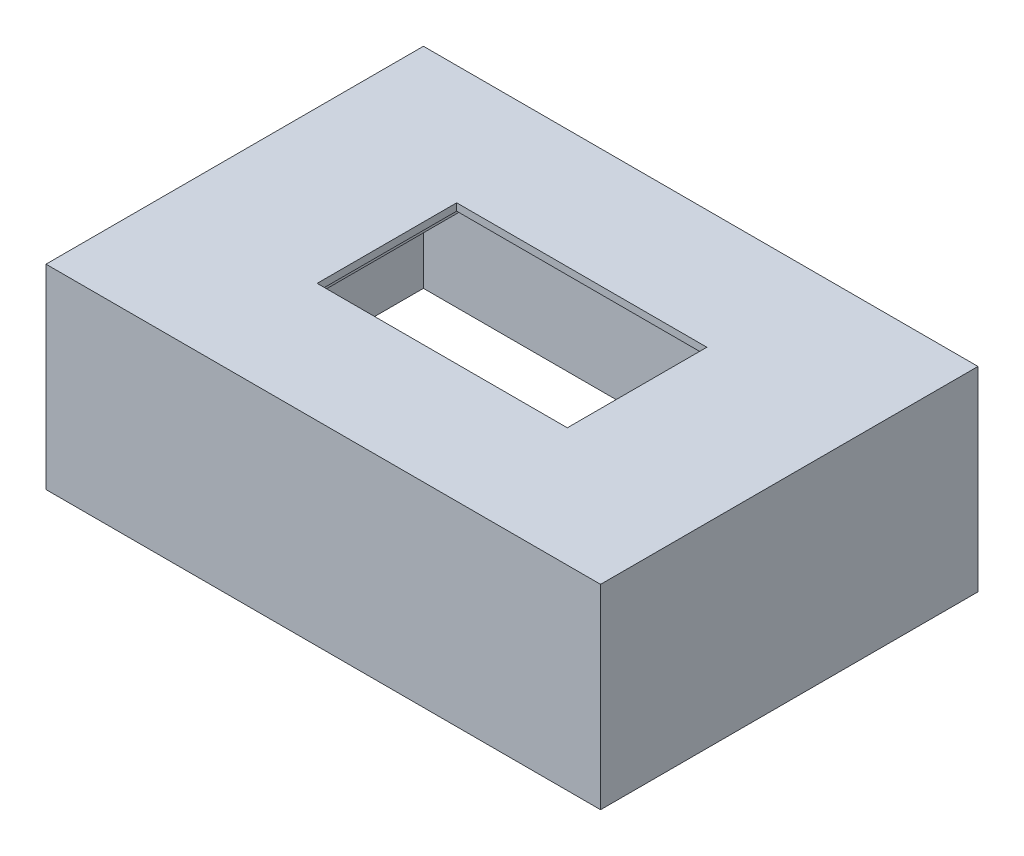
ISO-10303-21;
HEADER;
FILE_DESCRIPTION(('STEP AP214'),'2;1');
FILE_NAME('part.step','',(''),(''),'','','');
FILE_SCHEMA(('AUTOMOTIVE_DESIGN { 1 0 10303 214 1 1 1 1 }'));
ENDSEC;
DATA;
#1=APPLICATION_CONTEXT('core data for automotive mechanical design processes');
#2=APPLICATION_PROTOCOL_DEFINITION('international standard','automotive_design',2000,#1);
#3=PRODUCT_CONTEXT('',#1,'mechanical');
#4=PRODUCT('Part','Part','',(#3));
#5=PRODUCT_RELATED_PRODUCT_CATEGORY('part','',(#4));
#6=PRODUCT_DEFINITION_FORMATION('','',#4);
#7=PRODUCT_DEFINITION_CONTEXT('part definition',#1,'design');
#8=PRODUCT_DEFINITION('design','',#6,#7);
#9=PRODUCT_DEFINITION_SHAPE('','',#8);
#10=(LENGTH_UNIT() NAMED_UNIT(*) SI_UNIT(.MILLI.,.METRE.));
#11=(NAMED_UNIT(*) PLANE_ANGLE_UNIT() SI_UNIT($,.RADIAN.));
#12=(NAMED_UNIT(*) SI_UNIT($,.STERADIAN.) SOLID_ANGLE_UNIT());
#13=UNCERTAINTY_MEASURE_WITH_UNIT(LENGTH_MEASURE(1.E-05),#10,'distance_accuracy_value','');
#14=(GEOMETRIC_REPRESENTATION_CONTEXT(3) GLOBAL_UNCERTAINTY_ASSIGNED_CONTEXT((#13)) GLOBAL_UNIT_ASSIGNED_CONTEXT((#10,
#11,#12)) REPRESENTATION_CONTEXT('',''));
#15=CARTESIAN_POINT('',(0.,0.,0.));
#16=DIRECTION('',(0.,0.,1.));
#17=DIRECTION('',(1.,0.,0.));
#18=AXIS2_PLACEMENT_3D('',#15,#16,#17);
#19=CARTESIAN_POINT('',(-35.8900807899462,-14.6188086645724,22.0750448833034));
#20=DIRECTION('',(-1.,0.,0.));
#21=DIRECTION('',(0.,0.,1.));
#22=AXIS2_PLACEMENT_3D('',#19,#20,#21);
#23=PLANE('',#22);
#24=DIRECTION('',(0.,0.,1.));
#25=VECTOR('',#24,1.);
#26=CARTESIAN_POINT('',(-35.8900807899462,26.,22.0750448833034));
#27=LINE('',#26,#25);
#28=CARTESIAN_POINT('',(-35.8900807899462,26.,22.0750448833034));
#29=VERTEX_POINT('',#28);
#30=CARTESIAN_POINT('',(-35.8900807899462,26.,41.3750448833034));
#31=VERTEX_POINT('',#30);
#32=EDGE_CURVE('E357',#29,#31,#27,.T.);
#33=ORIENTED_EDGE('',*,*,#32,.F.);
#34=DIRECTION('',(0.,1.,0.));
#35=VECTOR('',#34,1.);
#36=CARTESIAN_POINT('',(-35.8900807899462,-14.6188086645724,22.0750448833034));
#37=LINE('',#36,#35);
#38=CARTESIAN_POINT('',(-35.8900807899462,27.,22.0750448833034));
#39=VERTEX_POINT('',#38);
#40=EDGE_CURVE('E377',#29,#39,#37,.T.);
#41=ORIENTED_EDGE('',*,*,#40,.T.);
#42=DIRECTION('',(0.,0.,1.));
#43=VECTOR('',#42,1.);
#44=CARTESIAN_POINT('',(-35.8900807899462,27.,22.0750448833034));
#45=LINE('',#44,#43);
#46=CARTESIAN_POINT('',(-35.8900807899462,27.,41.3750448833034));
#47=VERTEX_POINT('',#46);
#48=EDGE_CURVE('E360',#39,#47,#45,.T.);
#49=ORIENTED_EDGE('',*,*,#48,.T.);
#50=DIRECTION('',(0.,1.,0.));
#51=VECTOR('',#50,1.);
#52=CARTESIAN_POINT('',(-35.8900807899462,-14.6188086645724,41.3750448833034));
#53=LINE('',#52,#51);
#54=EDGE_CURVE('E376',#31,#47,#53,.T.);
#55=ORIENTED_EDGE('',*,*,#54,.F.);
#56=EDGE_LOOP('',(#33,#41,#49,#55));
#57=FACE_BOUND('',#56,.T.);
#58=ADVANCED_FACE('F38',(#57),#23,.F.);
#59=CARTESIAN_POINT('',(-35.8900807899462,-14.6188086645724,22.0750448833034));
#60=DIRECTION('',(0.,0.,-1.));
#61=DIRECTION('',(-1.,0.,0.));
#62=AXIS2_PLACEMENT_3D('',#59,#60,#61);
#63=PLANE('',#62);
#64=DIRECTION('',(-1.,0.,0.));
#65=VECTOR('',#64,1.);
#66=CARTESIAN_POINT('',(-35.8900807899462,26.,22.0750448833034));
#67=LINE('',#66,#65);
#68=CARTESIAN_POINT('',(-1.29008078994616,26.,22.0750448833034));
#69=VERTEX_POINT('',#68);
#70=EDGE_CURVE('E354',#69,#29,#67,.T.);
#71=ORIENTED_EDGE('',*,*,#70,.F.);
#72=DIRECTION('',(0.,1.,0.));
#73=VECTOR('',#72,1.);
#74=CARTESIAN_POINT('',(-1.29008078994616,-14.6188086645724,22.0750448833034));
#75=LINE('',#74,#73);
#76=CARTESIAN_POINT('',(-1.29008078994616,27.,22.0750448833034));
#77=VERTEX_POINT('',#76);
#78=EDGE_CURVE('E381',#69,#77,#75,.T.);
#79=ORIENTED_EDGE('',*,*,#78,.T.);
#80=DIRECTION('',(-1.,0.,0.));
#81=VECTOR('',#80,1.);
#82=CARTESIAN_POINT('',(-35.8900807899462,27.,22.0750448833034));
#83=LINE('',#82,#81);
#84=EDGE_CURVE('E372',#77,#39,#83,.T.);
#85=ORIENTED_EDGE('',*,*,#84,.T.);
#86=ORIENTED_EDGE('',*,*,#40,.F.);
#87=EDGE_LOOP('',(#71,#79,#85,#86));
#88=FACE_BOUND('',#87,.T.);
#89=ADVANCED_FACE('F487',(#88),#63,.F.);
#90=CARTESIAN_POINT('',(-1.29008078994616,-14.6188086645724,22.0750448833034));
#91=DIRECTION('',(1.,0.,0.));
#92=DIRECTION('',(0.,0.,-1.));
#93=AXIS2_PLACEMENT_3D('',#90,#91,#92);
#94=PLANE('',#93);
#95=DIRECTION('',(0.,0.,-1.));
#96=VECTOR('',#95,1.);
#97=CARTESIAN_POINT('',(-1.29008078994616,26.,22.0750448833034));
#98=LINE('',#97,#96);
#99=CARTESIAN_POINT('',(-1.29008078994616,26.,41.3750448833034));
#100=VERTEX_POINT('',#99);
#101=EDGE_CURVE('E342',#100,#69,#98,.T.);
#102=ORIENTED_EDGE('',*,*,#101,.F.);
#103=DIRECTION('',(0.,1.,0.));
#104=VECTOR('',#103,1.);
#105=CARTESIAN_POINT('',(-1.29008078994616,-14.6188086645724,41.3750448833034));
#106=LINE('',#105,#104);
#107=CARTESIAN_POINT('',(-1.29008078994616,27.,41.3750448833034));
#108=VERTEX_POINT('',#107);
#109=EDGE_CURVE('E384',#100,#108,#106,.T.);
#110=ORIENTED_EDGE('',*,*,#109,.T.);
#111=DIRECTION('',(0.,0.,-1.));
#112=VECTOR('',#111,1.);
#113=CARTESIAN_POINT('',(-1.29008078994616,27.,22.0750448833034));
#114=LINE('',#113,#112);
#115=EDGE_CURVE('E368',#108,#77,#114,.T.);
#116=ORIENTED_EDGE('',*,*,#115,.T.);
#117=ORIENTED_EDGE('',*,*,#78,.F.);
#118=EDGE_LOOP('',(#102,#110,#116,#117));
#119=FACE_BOUND('',#118,.T.);
#120=ADVANCED_FACE('F481',(#119),#94,.F.);
#121=CARTESIAN_POINT('',(-35.8900807899462,-14.6188086645724,41.3750448833034));
#122=DIRECTION('',(0.,0.,1.));
#123=DIRECTION('',(1.,0.,0.));
#124=AXIS2_PLACEMENT_3D('',#121,#122,#123);
#125=PLANE('',#124);
#126=DIRECTION('',(1.,0.,0.));
#127=VECTOR('',#126,1.);
#128=CARTESIAN_POINT('',(-35.8900807899462,26.,41.3750448833034));
#129=LINE('',#128,#127);
#130=EDGE_CURVE('E274',#31,#100,#129,.T.);
#131=ORIENTED_EDGE('',*,*,#130,.F.);
#132=ORIENTED_EDGE('',*,*,#54,.T.);
#133=DIRECTION('',(1.,0.,0.));
#134=VECTOR('',#133,1.);
#135=CARTESIAN_POINT('',(-35.8900807899462,27.,41.3750448833034));
#136=LINE('',#135,#134);
#137=EDGE_CURVE('E364',#47,#108,#136,.T.);
#138=ORIENTED_EDGE('',*,*,#137,.T.);
#139=ORIENTED_EDGE('',*,*,#109,.F.);
#140=EDGE_LOOP('',(#131,#132,#138,#139));
#141=FACE_BOUND('',#140,.T.);
#142=ADVANCED_FACE('F472',(#141),#125,.F.);
#143=CARTESIAN_POINT('',(0.,25.,0.));
#144=DIRECTION('',(0.,1.,0.));
#145=DIRECTION('',(0.,0.,1.));
#146=AXIS2_PLACEMENT_3D('',#143,#144,#145);
#147=PLANE('',#146);
#148=DIRECTION('',(0.,0.,-1.));
#149=VECTOR('',#148,1.);
#150=CARTESIAN_POINT('',(-52.9400807899462,25.,0.));
#151=LINE('',#150,#149);
#152=CARTESIAN_POINT('',(-52.9400807899462,25.,53.8250448833034));
#153=VERTEX_POINT('',#152);
#154=CARTESIAN_POINT('',(-52.9400807899462,25.,9.6250448833034));
#155=VERTEX_POINT('',#154);
#156=EDGE_CURVE('E284',#153,#155,#151,.T.);
#157=ORIENTED_EDGE('',*,*,#156,.T.);
#158=DIRECTION('',(1.,0.,0.));
#159=VECTOR('',#158,1.);
#160=CARTESIAN_POINT('',(0.,25.,9.6250448833034));
#161=LINE('',#160,#159);
#162=CARTESIAN_POINT('',(15.7599192100539,25.,9.6250448833034));
#163=VERTEX_POINT('',#162);
#164=EDGE_CURVE('E290',#155,#163,#161,.T.);
#165=ORIENTED_EDGE('',*,*,#164,.T.);
#166=DIRECTION('',(0.,0.,1.));
#167=VECTOR('',#166,1.);
#168=CARTESIAN_POINT('',(15.7599192100539,25.,0.));
#169=LINE('',#168,#167);
#170=CARTESIAN_POINT('',(15.7599192100539,25.,53.8250448833034));
#171=VERTEX_POINT('',#170);
#172=EDGE_CURVE('E287',#163,#171,#169,.T.);
#173=ORIENTED_EDGE('',*,*,#172,.T.);
#174=DIRECTION('',(-1.,0.,0.));
#175=VECTOR('',#174,1.);
#176=CARTESIAN_POINT('',(0.,25.,53.8250448833034));
#177=LINE('',#176,#175);
#178=EDGE_CURVE('E281',#171,#153,#177,.T.);
#179=ORIENTED_EDGE('',*,*,#178,.T.);
#180=EDGE_LOOP('',(#157,#165,#173,#179));
#181=FACE_BOUND('',#180,.T.);
#182=DIRECTION('',(1.,0.,0.));
#183=VECTOR('',#182,1.);
#184=CARTESIAN_POINT('',(-36.5900807899461,25.,14.5750448833034));
#185=LINE('',#184,#183);
#186=CARTESIAN_POINT('',(-36.5900807899461,25.,14.5750448833034));
#187=VERTEX_POINT('',#186);
#188=CARTESIAN_POINT('',(-0.590080789946152,25.,14.5750448833034));
#189=VERTEX_POINT('',#188);
#190=EDGE_CURVE('E318',#187,#189,#185,.T.);
#191=ORIENTED_EDGE('',*,*,#190,.F.);
#192=DIRECTION('',(0.,0.,-1.));
#193=VECTOR('',#192,1.);
#194=CARTESIAN_POINT('',(-36.5900807899461,25.,48.8750448833034));
#195=LINE('',#194,#193);
#196=CARTESIAN_POINT('',(-36.5900807899461,25.,48.8750448833034));
#197=VERTEX_POINT('',#196);
#198=EDGE_CURVE('E312',#197,#187,#195,.T.);
#199=ORIENTED_EDGE('',*,*,#198,.F.);
#200=DIRECTION('',(-1.,0.,0.));
#201=VECTOR('',#200,1.);
#202=CARTESIAN_POINT('',(-36.5900807899461,25.,48.8750448833034));
#203=LINE('',#202,#201);
#204=CARTESIAN_POINT('',(-0.590080789946155,25.,48.8750448833034));
#205=VERTEX_POINT('',#204);
#206=EDGE_CURVE('E334',#205,#197,#203,.T.);
#207=ORIENTED_EDGE('',*,*,#206,.F.);
#208=DIRECTION('',(0.,0.,1.));
#209=VECTOR('',#208,1.);
#210=CARTESIAN_POINT('',(-0.590080789946155,25.,48.8750448833034));
#211=LINE('',#210,#209);
#212=EDGE_CURVE('E325',#189,#205,#211,.T.);
#213=ORIENTED_EDGE('',*,*,#212,.F.);
#214=EDGE_LOOP('',(#191,#199,#207,#213));
#215=FACE_BOUND('',#214,.T.);
#216=ADVANCED_FACE('F470',(#181,#215),#147,.F.);
#217=CARTESIAN_POINT('',(0.,0.,0.));
#218=DIRECTION('',(0.,1.,0.));
#219=DIRECTION('',(0.,0.,1.));
#220=AXIS2_PLACEMENT_3D('',#217,#218,#219);
#221=PLANE('',#220);
#222=DIRECTION('',(0.,0.,1.));
#223=VECTOR('',#222,1.);
#224=CARTESIAN_POINT('',(-54.9400807899462,0.,7.62504488330341));
#225=LINE('',#224,#223);
#226=CARTESIAN_POINT('',(-54.9400807899462,0.,7.62504488330341));
#227=VERTEX_POINT('',#226);
#228=CARTESIAN_POINT('',(-54.9400807899462,0.,27.1283231315116));
#229=VERTEX_POINT('',#228);
#230=EDGE_CURVE('E205',#227,#229,#225,.T.);
#231=ORIENTED_EDGE('',*,*,#230,.T.);
#232=DIRECTION('',(-1.,0.,0.));
#233=VECTOR('',#232,1.);
#234=CARTESIAN_POINT('',(-37.0025301753447,0.,27.1283231315116));
#235=LINE('',#234,#233);
#236=CARTESIAN_POINT('',(-56.9400807899462,0.,27.1283231315116));
#237=VERTEX_POINT('',#236);
#238=EDGE_CURVE('E189',#229,#237,#235,.T.);
#239=ORIENTED_EDGE('',*,*,#238,.T.);
#240=DIRECTION('',(0.,0.,1.));
#241=VECTOR('',#240,1.);
#242=CARTESIAN_POINT('',(-56.9400807899462,0.,5.62504488330341));
#243=LINE('',#242,#241);
#244=CARTESIAN_POINT('',(-56.9400807899462,0.,5.62504488330341));
#245=VERTEX_POINT('',#244);
#246=EDGE_CURVE('E246',#245,#237,#243,.T.);
#247=ORIENTED_EDGE('',*,*,#246,.F.);
#248=DIRECTION('',(-1.,0.,0.));
#249=VECTOR('',#248,1.);
#250=CARTESIAN_POINT('',(-56.9400807899462,0.,5.62504488330341));
#251=LINE('',#250,#249);
#252=CARTESIAN_POINT('',(19.7599192100538,0.,5.62504488330341));
#253=VERTEX_POINT('',#252);
#254=EDGE_CURVE('E255',#253,#245,#251,.T.);
#255=ORIENTED_EDGE('',*,*,#254,.F.);
#256=DIRECTION('',(0.,0.,-1.));
#257=VECTOR('',#256,1.);
#258=CARTESIAN_POINT('',(19.7599192100538,0.,5.62504488330341));
#259=LINE('',#258,#257);
#260=CARTESIAN_POINT('',(19.7599192100539,0.,57.8250448833034));
#261=VERTEX_POINT('',#260);
#262=EDGE_CURVE('E252',#261,#253,#259,.T.);
#263=ORIENTED_EDGE('',*,*,#262,.F.);
#264=DIRECTION('',(1.,0.,0.));
#265=VECTOR('',#264,1.);
#266=CARTESIAN_POINT('',(-56.9400807899462,0.,57.8250448833034));
#267=LINE('',#266,#265);
#268=CARTESIAN_POINT('',(-56.9400807899462,0.,57.8250448833034));
#269=VERTEX_POINT('',#268);
#270=EDGE_CURVE('E249',#269,#261,#267,.T.);
#271=ORIENTED_EDGE('',*,*,#270,.F.);
#272=CARTESIAN_POINT('',(-56.9400807899462,0.,35.6283231315116));
#273=VERTEX_POINT('',#272);
#274=EDGE_CURVE('E245',#273,#269,#243,.T.);
#275=ORIENTED_EDGE('',*,*,#274,.F.);
#276=DIRECTION('',(-1.,0.,0.));
#277=VECTOR('',#276,1.);
#278=CARTESIAN_POINT('',(-37.0025301753447,0.,35.6283231315116));
#279=LINE('',#278,#277);
#280=CARTESIAN_POINT('',(-54.9400807899462,0.,35.6283231315116));
#281=VERTEX_POINT('',#280);
#282=EDGE_CURVE('E201',#281,#273,#279,.T.);
#283=ORIENTED_EDGE('',*,*,#282,.F.);
#284=CARTESIAN_POINT('',(-54.9400807899462,0.,55.8250448833034));
#285=VERTEX_POINT('',#284);
#286=EDGE_CURVE('E218',#281,#285,#225,.T.);
#287=ORIENTED_EDGE('',*,*,#286,.T.);
#288=DIRECTION('',(1.,0.,0.));
#289=VECTOR('',#288,1.);
#290=CARTESIAN_POINT('',(-54.9400807899462,0.,55.8250448833034));
#291=LINE('',#290,#289);
#292=CARTESIAN_POINT('',(17.7599192100538,0.,55.8250448833034));
#293=VERTEX_POINT('',#292);
#294=EDGE_CURVE('E217',#285,#293,#291,.T.);
#295=ORIENTED_EDGE('',*,*,#294,.T.);
#296=DIRECTION('',(0.,0.,-1.));
#297=VECTOR('',#296,1.);
#298=CARTESIAN_POINT('',(17.7599192100538,0.,7.62504488330341));
#299=LINE('',#298,#297);
#300=CARTESIAN_POINT('',(17.7599192100538,0.,7.62504488330341));
#301=VERTEX_POINT('',#300);
#302=EDGE_CURVE('E223',#293,#301,#299,.T.);
#303=ORIENTED_EDGE('',*,*,#302,.T.);
#304=DIRECTION('',(-1.,0.,0.));
#305=VECTOR('',#304,1.);
#306=CARTESIAN_POINT('',(-54.9400807899462,0.,7.62504488330341));
#307=LINE('',#306,#305);
#308=EDGE_CURVE('E215',#301,#227,#307,.T.);
#309=ORIENTED_EDGE('',*,*,#308,.T.);
#310=EDGE_LOOP('',(#231,#239,#247,#255,#263,#271,#275,#283,#287,#295,#303,#309));
#311=FACE_BOUND('',#310,.T.);
#312=ADVANCED_FACE('F212',(#311),#221,.F.);
#313=CARTESIAN_POINT('',(-56.9400807899462,25.,5.62504488330341));
#314=DIRECTION('',(1.,0.,0.));
#315=DIRECTION('',(0.,0.,-1.));
#316=AXIS2_PLACEMENT_3D('',#313,#314,#315);
#317=PLANE('',#316);
#318=ORIENTED_EDGE('',*,*,#246,.T.);
#319=DIRECTION('',(0.,-1.,0.));
#320=VECTOR('',#319,1.);
#321=CARTESIAN_POINT('',(-56.9400807899462,11.5457501262647,27.1283231315116));
#322=LINE('',#321,#320);
#323=CARTESIAN_POINT('',(-56.9400807899462,11.5457501262647,27.1283231315116));
#324=VERTEX_POINT('',#323);
#325=EDGE_CURVE('E195',#324,#237,#322,.T.);
#326=ORIENTED_EDGE('',*,*,#325,.F.);
#327=CARTESIAN_POINT('',(-56.9400807899462,11.5457501262647,31.3783231315116));
#328=DIRECTION('',(-1.,0.,0.));
#329=DIRECTION('',(0.,0.,1.));
#330=AXIS2_PLACEMENT_3D('',#327,#328,#329);
#331=CIRCLE('',#330,4.25);
#332=CARTESIAN_POINT('',(-56.9400807899462,11.5457501262647,35.6283231315116));
#333=VERTEX_POINT('',#332);
#334=EDGE_CURVE('E420',#333,#324,#331,.T.);
#335=ORIENTED_EDGE('',*,*,#334,.F.);
#336=DIRECTION('',(0.,1.,0.));
#337=VECTOR('',#336,1.);
#338=CARTESIAN_POINT('',(-56.9400807899462,11.5457501262647,35.6283231315116));
#339=LINE('',#338,#337);
#340=EDGE_CURVE('E210',#273,#333,#339,.T.);
#341=ORIENTED_EDGE('',*,*,#340,.F.);
#342=ORIENTED_EDGE('',*,*,#274,.T.);
#343=DIRECTION('',(0.,-1.,0.));
#344=VECTOR('',#343,1.);
#345=CARTESIAN_POINT('',(-56.9400807899462,25.,57.8250448833034));
#346=LINE('',#345,#344);
#347=CARTESIAN_POINT('',(-56.9400807899462,27.,57.8250448833034));
#348=VERTEX_POINT('',#347);
#349=EDGE_CURVE('E270',#348,#269,#346,.T.);
#350=ORIENTED_EDGE('',*,*,#349,.F.);
#351=DIRECTION('',(0.,0.,1.));
#352=VECTOR('',#351,1.);
#353=CARTESIAN_POINT('',(-56.9400807899462,27.,5.62504488330341));
#354=LINE('',#353,#352);
#355=CARTESIAN_POINT('',(-56.9400807899462,27.,5.62504488330341));
#356=VERTEX_POINT('',#355);
#357=EDGE_CURVE('E380',#356,#348,#354,.T.);
#358=ORIENTED_EDGE('',*,*,#357,.F.);
#359=DIRECTION('',(0.,-1.,0.));
#360=VECTOR('',#359,1.);
#361=CARTESIAN_POINT('',(-56.9400807899462,25.,5.62504488330341));
#362=LINE('',#361,#360);
#363=EDGE_CURVE('E258',#356,#245,#362,.T.);
#364=ORIENTED_EDGE('',*,*,#363,.T.);
#365=EDGE_LOOP('',(#318,#326,#335,#341,#342,#350,#358,#364));
#366=FACE_BOUND('',#365,.T.);
#367=ADVANCED_FACE('F407',(#366),#317,.F.);
#368=CARTESIAN_POINT('',(-56.9400807899462,25.,57.8250448833034));
#369=DIRECTION('',(0.,0.,-1.));
#370=DIRECTION('',(-1.,0.,0.));
#371=AXIS2_PLACEMENT_3D('',#368,#369,#370);
#372=PLANE('',#371);
#373=ORIENTED_EDGE('',*,*,#270,.T.);
#374=DIRECTION('',(0.,-1.,0.));
#375=VECTOR('',#374,1.);
#376=CARTESIAN_POINT('',(19.7599192100539,25.,57.8250448833034));
#377=LINE('',#376,#375);
#378=CARTESIAN_POINT('',(19.7599192100539,27.,57.8250448833034));
#379=VERTEX_POINT('',#378);
#380=EDGE_CURVE('E266',#379,#261,#377,.T.);
#381=ORIENTED_EDGE('',*,*,#380,.F.);
#382=DIRECTION('',(1.,0.,0.));
#383=VECTOR('',#382,1.);
#384=CARTESIAN_POINT('',(-56.9400807899462,27.,57.8250448833034));
#385=LINE('',#384,#383);
#386=EDGE_CURVE('E392',#348,#379,#385,.T.);
#387=ORIENTED_EDGE('',*,*,#386,.F.);
#388=ORIENTED_EDGE('',*,*,#349,.T.);
#389=EDGE_LOOP('',(#373,#381,#387,#388));
#390=FACE_BOUND('',#389,.T.);
#391=ADVANCED_FACE('F413',(#390),#372,.F.);
#392=CARTESIAN_POINT('',(19.7599192100538,25.,5.62504488330341));
#393=DIRECTION('',(-1.,0.,0.));
#394=DIRECTION('',(0.,0.,1.));
#395=AXIS2_PLACEMENT_3D('',#392,#393,#394);
#396=PLANE('',#395);
#397=ORIENTED_EDGE('',*,*,#262,.T.);
#398=DIRECTION('',(0.,-1.,0.));
#399=VECTOR('',#398,1.);
#400=CARTESIAN_POINT('',(19.7599192100538,25.,5.62504488330341));
#401=LINE('',#400,#399);
#402=CARTESIAN_POINT('',(19.7599192100539,27.,5.62504488330341));
#403=VERTEX_POINT('',#402);
#404=EDGE_CURVE('E262',#403,#253,#401,.T.);
#405=ORIENTED_EDGE('',*,*,#404,.F.);
#406=DIRECTION('',(0.,0.,-1.));
#407=VECTOR('',#406,1.);
#408=CARTESIAN_POINT('',(19.7599192100539,27.,5.62504488330341));
#409=LINE('',#408,#407);
#410=EDGE_CURVE('E395',#379,#403,#409,.T.);
#411=ORIENTED_EDGE('',*,*,#410,.F.);
#412=ORIENTED_EDGE('',*,*,#380,.T.);
#413=EDGE_LOOP('',(#397,#405,#411,#412));
#414=FACE_BOUND('',#413,.T.);
#415=ADVANCED_FACE('F415',(#414),#396,.F.);
#416=CARTESIAN_POINT('',(-56.9400807899462,25.,5.62504488330341));
#417=DIRECTION('',(0.,0.,1.));
#418=DIRECTION('',(1.,0.,0.));
#419=AXIS2_PLACEMENT_3D('',#416,#417,#418);
#420=PLANE('',#419);
#421=ORIENTED_EDGE('',*,*,#254,.T.);
#422=ORIENTED_EDGE('',*,*,#363,.F.);
#423=DIRECTION('',(-1.,0.,0.));
#424=VECTOR('',#423,1.);
#425=CARTESIAN_POINT('',(-56.9400807899462,27.,5.62504488330341));
#426=LINE('',#425,#424);
#427=EDGE_CURVE('E225',#403,#356,#426,.T.);
#428=ORIENTED_EDGE('',*,*,#427,.F.);
#429=ORIENTED_EDGE('',*,*,#404,.T.);
#430=EDGE_LOOP('',(#421,#422,#428,#429));
#431=FACE_BOUND('',#430,.T.);
#432=ADVANCED_FACE('F418',(#431),#420,.F.);
#433=CARTESIAN_POINT('',(-54.9400807899462,25.,7.62504488330341));
#434=DIRECTION('',(1.,0.,0.));
#435=DIRECTION('',(0.,0.,-1.));
#436=AXIS2_PLACEMENT_3D('',#433,#434,#435);
#437=PLANE('',#436);
#438=DIRECTION('',(0.,-1.,0.));
#439=VECTOR('',#438,1.);
#440=CARTESIAN_POINT('',(-54.9400807899462,11.5457501262647,27.1283231315116));
#441=LINE('',#440,#439);
#442=CARTESIAN_POINT('',(-54.9400807899462,11.5457501262647,27.1283231315116));
#443=VERTEX_POINT('',#442);
#444=EDGE_CURVE('E192',#443,#229,#441,.T.);
#445=ORIENTED_EDGE('',*,*,#444,.T.);
#446=ORIENTED_EDGE('',*,*,#230,.F.);
#447=DIRECTION('',(0.,-1.,0.));
#448=VECTOR('',#447,1.);
#449=CARTESIAN_POINT('',(-54.9400807899462,25.,7.62504488330341));
#450=LINE('',#449,#448);
#451=CARTESIAN_POINT('',(-54.9400807899462,23.,7.62504488330341));
#452=VERTEX_POINT('',#451);
#453=EDGE_CURVE('E233',#452,#227,#450,.T.);
#454=ORIENTED_EDGE('',*,*,#453,.F.);
#455=DIRECTION('',(0.,0.,1.));
#456=VECTOR('',#455,1.);
#457=CARTESIAN_POINT('',(-54.9400807899462,23.,7.62504488330341));
#458=LINE('',#457,#456);
#459=CARTESIAN_POINT('',(-54.9400807899462,23.,55.8250448833034));
#460=VERTEX_POINT('',#459);
#461=EDGE_CURVE('E48',#452,#460,#458,.T.);
#462=ORIENTED_EDGE('',*,*,#461,.T.);
#463=DIRECTION('',(0.,-1.,0.));
#464=VECTOR('',#463,1.);
#465=CARTESIAN_POINT('',(-54.9400807899462,25.,55.8250448833034));
#466=LINE('',#465,#464);
#467=EDGE_CURVE('E242',#460,#285,#466,.T.);
#468=ORIENTED_EDGE('',*,*,#467,.T.);
#469=ORIENTED_EDGE('',*,*,#286,.F.);
#470=DIRECTION('',(0.,1.,0.));
#471=VECTOR('',#470,1.);
#472=CARTESIAN_POINT('',(-54.9400807899462,11.5457501262647,35.6283231315116));
#473=LINE('',#472,#471);
#474=CARTESIAN_POINT('',(-54.9400807899462,11.5457501262647,35.6283231315116));
#475=VERTEX_POINT('',#474);
#476=EDGE_CURVE('E432',#281,#475,#473,.T.);
#477=ORIENTED_EDGE('',*,*,#476,.T.);
#478=CARTESIAN_POINT('',(-54.9400807899462,11.5457501262647,31.3783231315116));
#479=DIRECTION('',(1.,0.,0.));
#480=DIRECTION('',(0.,0.,-1.));
#481=AXIS2_PLACEMENT_3D('',#478,#479,#480);
#482=CIRCLE('',#481,4.25);
#483=EDGE_CURVE('E208',#475,#443,#482,.F.);
#484=ORIENTED_EDGE('',*,*,#483,.T.);
#485=EDGE_LOOP('',(#445,#446,#454,#462,#468,#469,#477,#484));
#486=FACE_BOUND('',#485,.T.);
#487=ADVANCED_FACE('F204',(#486),#437,.T.);
#488=CARTESIAN_POINT('',(-54.9400807899462,25.,55.8250448833034));
#489=DIRECTION('',(0.,0.,-1.));
#490=DIRECTION('',(-1.,0.,0.));
#491=AXIS2_PLACEMENT_3D('',#488,#489,#490);
#492=PLANE('',#491);
#493=ORIENTED_EDGE('',*,*,#467,.F.);
#494=DIRECTION('',(1.,0.,0.));
#495=VECTOR('',#494,1.);
#496=CARTESIAN_POINT('',(-54.9400807899462,23.,55.8250448833034));
#497=LINE('',#496,#495);
#498=CARTESIAN_POINT('',(17.7599192100538,23.,55.8250448833034));
#499=VERTEX_POINT('',#498);
#500=EDGE_CURVE('E11',#460,#499,#497,.T.);
#501=ORIENTED_EDGE('',*,*,#500,.T.);
#502=DIRECTION('',(0.,-1.,0.));
#503=VECTOR('',#502,1.);
#504=CARTESIAN_POINT('',(17.7599192100538,25.,55.8250448833034));
#505=LINE('',#504,#503);
#506=EDGE_CURVE('E239',#499,#293,#505,.T.);
#507=ORIENTED_EDGE('',*,*,#506,.T.);
#508=ORIENTED_EDGE('',*,*,#294,.F.);
#509=EDGE_LOOP('',(#493,#501,#507,#508));
#510=FACE_BOUND('',#509,.T.);
#511=ADVANCED_FACE('F549',(#510),#492,.T.);
#512=CARTESIAN_POINT('',(17.7599192100538,25.,7.62504488330341));
#513=DIRECTION('',(-1.,0.,0.));
#514=DIRECTION('',(0.,0.,1.));
#515=AXIS2_PLACEMENT_3D('',#512,#513,#514);
#516=PLANE('',#515);
#517=ORIENTED_EDGE('',*,*,#506,.F.);
#518=DIRECTION('',(0.,0.,-1.));
#519=VECTOR('',#518,1.);
#520=CARTESIAN_POINT('',(17.7599192100538,23.,7.62504488330341));
#521=LINE('',#520,#519);
#522=CARTESIAN_POINT('',(17.7599192100538,23.,7.62504488330341));
#523=VERTEX_POINT('',#522);
#524=EDGE_CURVE('E294',#499,#523,#521,.T.);
#525=ORIENTED_EDGE('',*,*,#524,.T.);
#526=DIRECTION('',(0.,-1.,0.));
#527=VECTOR('',#526,1.);
#528=CARTESIAN_POINT('',(17.7599192100538,25.,7.62504488330341));
#529=LINE('',#528,#527);
#530=EDGE_CURVE('E236',#523,#301,#529,.T.);
#531=ORIENTED_EDGE('',*,*,#530,.T.);
#532=ORIENTED_EDGE('',*,*,#302,.F.);
#533=EDGE_LOOP('',(#517,#525,#531,#532));
#534=FACE_BOUND('',#533,.T.);
#535=ADVANCED_FACE('F505',(#534),#516,.T.);
#536=CARTESIAN_POINT('',(-54.9400807899462,25.,7.62504488330341));
#537=DIRECTION('',(0.,0.,1.));
#538=DIRECTION('',(1.,0.,0.));
#539=AXIS2_PLACEMENT_3D('',#536,#537,#538);
#540=PLANE('',#539);
#541=ORIENTED_EDGE('',*,*,#530,.F.);
#542=DIRECTION('',(-1.,0.,0.));
#543=VECTOR('',#542,1.);
#544=CARTESIAN_POINT('',(-54.9400807899462,23.,7.62504488330341));
#545=LINE('',#544,#543);
#546=EDGE_CURVE('E277',#523,#452,#545,.T.);
#547=ORIENTED_EDGE('',*,*,#546,.T.);
#548=ORIENTED_EDGE('',*,*,#453,.T.);
#549=ORIENTED_EDGE('',*,*,#308,.F.);
#550=EDGE_LOOP('',(#541,#547,#548,#549));
#551=FACE_BOUND('',#550,.T.);
#552=ADVANCED_FACE('F498',(#551),#540,.T.);
#553=CARTESIAN_POINT('',(0.,27.,0.));
#554=DIRECTION('',(0.,1.,0.));
#555=DIRECTION('',(0.,0.,1.));
#556=AXIS2_PLACEMENT_3D('',#553,#554,#555);
#557=PLANE('',#556);
#558=ORIENTED_EDGE('',*,*,#48,.F.);
#559=ORIENTED_EDGE('',*,*,#84,.F.);
#560=ORIENTED_EDGE('',*,*,#115,.F.);
#561=ORIENTED_EDGE('',*,*,#137,.F.);
#562=EDGE_LOOP('',(#558,#559,#560,#561));
#563=FACE_BOUND('',#562,.T.);
#564=ORIENTED_EDGE('',*,*,#357,.T.);
#565=ORIENTED_EDGE('',*,*,#386,.T.);
#566=ORIENTED_EDGE('',*,*,#410,.T.);
#567=ORIENTED_EDGE('',*,*,#427,.T.);
#568=EDGE_LOOP('',(#564,#565,#566,#567));
#569=FACE_BOUND('',#568,.T.);
#570=ADVANCED_FACE('F404',(#563,#569),#557,.T.);
#571=CARTESIAN_POINT('',(0.,26.,0.));
#572=DIRECTION('',(0.,-1.,0.));
#573=DIRECTION('',(0.,0.,-1.));
#574=AXIS2_PLACEMENT_3D('',#571,#572,#573);
#575=PLANE('',#574);
#576=DIRECTION('',(0.,0.,-1.));
#577=VECTOR('',#576,1.);
#578=CARTESIAN_POINT('',(-36.5900807899461,26.,48.8750448833034));
#579=LINE('',#578,#577);
#580=CARTESIAN_POINT('',(-36.5900807899461,26.,48.8750448833034));
#581=VERTEX_POINT('',#580);
#582=CARTESIAN_POINT('',(-36.5900807899461,26.,14.5750448833034));
#583=VERTEX_POINT('',#582);
#584=EDGE_CURVE('E338',#581,#583,#579,.T.);
#585=ORIENTED_EDGE('',*,*,#584,.T.);
#586=DIRECTION('',(1.,0.,0.));
#587=VECTOR('',#586,1.);
#588=CARTESIAN_POINT('',(-36.5900807899461,26.,14.5750448833034));
#589=LINE('',#588,#587);
#590=CARTESIAN_POINT('',(-0.590080789946152,26.,14.5750448833034));
#591=VERTEX_POINT('',#590);
#592=EDGE_CURVE('E444',#583,#591,#589,.T.);
#593=ORIENTED_EDGE('',*,*,#592,.T.);
#594=DIRECTION('',(0.,0.,1.));
#595=VECTOR('',#594,1.);
#596=CARTESIAN_POINT('',(-0.590080789946155,26.,48.8750448833034));
#597=LINE('',#596,#595);
#598=CARTESIAN_POINT('',(-0.590080789946155,26.,48.8750448833034));
#599=VERTEX_POINT('',#598);
#600=EDGE_CURVE('E447',#591,#599,#597,.T.);
#601=ORIENTED_EDGE('',*,*,#600,.T.);
#602=DIRECTION('',(-1.,0.,0.));
#603=VECTOR('',#602,1.);
#604=CARTESIAN_POINT('',(-36.5900807899461,26.,48.8750448833034));
#605=LINE('',#604,#603);
#606=EDGE_CURVE('E328',#599,#581,#605,.T.);
#607=ORIENTED_EDGE('',*,*,#606,.T.);
#608=EDGE_LOOP('',(#585,#593,#601,#607));
#609=FACE_BOUND('',#608,.T.);
#610=ORIENTED_EDGE('',*,*,#32,.T.);
#611=ORIENTED_EDGE('',*,*,#130,.T.);
#612=ORIENTED_EDGE('',*,*,#101,.T.);
#613=ORIENTED_EDGE('',*,*,#70,.T.);
#614=EDGE_LOOP('',(#610,#611,#612,#613));
#615=FACE_BOUND('',#614,.T.);
#616=ADVANCED_FACE('F455',(#609,#615),#575,.T.);
#617=CARTESIAN_POINT('',(-36.5900807899461,26.,48.8750448833034));
#618=DIRECTION('',(-1.,0.,0.));
#619=DIRECTION('',(0.,0.,1.));
#620=AXIS2_PLACEMENT_3D('',#617,#618,#619);
#621=PLANE('',#620);
#622=ORIENTED_EDGE('',*,*,#198,.T.);
#623=DIRECTION('',(0.,-1.,0.));
#624=VECTOR('',#623,1.);
#625=CARTESIAN_POINT('',(-36.5900807899461,26.,14.5750448833034));
#626=LINE('',#625,#624);
#627=EDGE_CURVE('E349',#583,#187,#626,.T.);
#628=ORIENTED_EDGE('',*,*,#627,.F.);
#629=ORIENTED_EDGE('',*,*,#584,.F.);
#630=DIRECTION('',(0.,-1.,0.));
#631=VECTOR('',#630,1.);
#632=CARTESIAN_POINT('',(-36.5900807899461,26.,48.8750448833034));
#633=LINE('',#632,#631);
#634=EDGE_CURVE('E339',#581,#197,#633,.T.);
#635=ORIENTED_EDGE('',*,*,#634,.T.);
#636=EDGE_LOOP('',(#622,#628,#629,#635));
#637=FACE_BOUND('',#636,.T.);
#638=ADVANCED_FACE('F461',(#637),#621,.F.);
#639=CARTESIAN_POINT('',(-36.5900807899461,26.,48.8750448833034));
#640=DIRECTION('',(0.,0.,1.));
#641=DIRECTION('',(1.,0.,0.));
#642=AXIS2_PLACEMENT_3D('',#639,#640,#641);
#643=PLANE('',#642);
#644=ORIENTED_EDGE('',*,*,#206,.T.);
#645=ORIENTED_EDGE('',*,*,#634,.F.);
#646=ORIENTED_EDGE('',*,*,#606,.F.);
#647=DIRECTION('',(0.,-1.,0.));
#648=VECTOR('',#647,1.);
#649=CARTESIAN_POINT('',(-0.590080789946155,26.,48.8750448833034));
#650=LINE('',#649,#648);
#651=EDGE_CURVE('E343',#599,#205,#650,.T.);
#652=ORIENTED_EDGE('',*,*,#651,.T.);
#653=EDGE_LOOP('',(#644,#645,#646,#652));
#654=FACE_BOUND('',#653,.T.);
#655=ADVANCED_FACE('F459',(#654),#643,.F.);
#656=CARTESIAN_POINT('',(-0.590080789946155,26.,48.8750448833034));
#657=DIRECTION('',(1.,0.,0.));
#658=DIRECTION('',(0.,0.,-1.));
#659=AXIS2_PLACEMENT_3D('',#656,#657,#658);
#660=PLANE('',#659);
#661=ORIENTED_EDGE('',*,*,#212,.T.);
#662=ORIENTED_EDGE('',*,*,#651,.F.);
#663=ORIENTED_EDGE('',*,*,#600,.F.);
#664=DIRECTION('',(0.,-1.,0.));
#665=VECTOR('',#664,1.);
#666=CARTESIAN_POINT('',(-0.590080789946152,26.,14.5750448833034));
#667=LINE('',#666,#665);
#668=EDGE_CURVE('E346',#591,#189,#667,.T.);
#669=ORIENTED_EDGE('',*,*,#668,.T.);
#670=EDGE_LOOP('',(#661,#662,#663,#669));
#671=FACE_BOUND('',#670,.T.);
#672=ADVANCED_FACE('F468',(#671),#660,.F.);
#673=CARTESIAN_POINT('',(-36.5900807899461,26.,14.5750448833034));
#674=DIRECTION('',(0.,0.,-1.));
#675=DIRECTION('',(-1.,0.,0.));
#676=AXIS2_PLACEMENT_3D('',#673,#674,#675);
#677=PLANE('',#676);
#678=ORIENTED_EDGE('',*,*,#190,.T.);
#679=ORIENTED_EDGE('',*,*,#668,.F.);
#680=ORIENTED_EDGE('',*,*,#592,.F.);
#681=ORIENTED_EDGE('',*,*,#627,.T.);
#682=EDGE_LOOP('',(#678,#679,#680,#681));
#683=FACE_BOUND('',#682,.T.);
#684=ADVANCED_FACE('F465',(#683),#677,.F.);
#685=CARTESIAN_POINT('',(-54.9400807899462,23.,55.8250448833034));
#686=DIRECTION('',(0.,0.707106781186545,0.70710678118655));
#687=DIRECTION('',(1.,0.,0.));
#688=AXIS2_PLACEMENT_3D('',#685,#686,#687);
#689=PLANE('',#688);
#690=DIRECTION('',(0.577350269189625,0.577350269189628,-0.577350269189624));
#691=VECTOR('',#690,1.);
#692=CARTESIAN_POINT('',(-38.8734141232796,39.0666666666667,39.7583782166368));
#693=LINE('',#692,#691);
#694=EDGE_CURVE('E304',#153,#460,#693,.F.);
#695=ORIENTED_EDGE('',*,*,#694,.F.);
#696=ORIENTED_EDGE('',*,*,#178,.F.);
#697=DIRECTION('',(0.577350269189624,-0.577350269189629,0.577350269189625));
#698=VECTOR('',#697,1.);
#699=CARTESIAN_POINT('',(1.69325254338727,39.0666666666667,39.7583782166368));
#700=LINE('',#699,#698);
#701=EDGE_CURVE('E42',#499,#171,#700,.F.);
#702=ORIENTED_EDGE('',*,*,#701,.F.);
#703=ORIENTED_EDGE('',*,*,#500,.F.);
#704=EDGE_LOOP('',(#695,#696,#702,#703));
#705=FACE_BOUND('',#704,.T.);
#706=ADVANCED_FACE('F40',(#705),#689,.F.);
#707=CARTESIAN_POINT('',(17.7599192100538,23.,7.62504488330341));
#708=DIRECTION('',(0.707106781186551,0.707106781186544,0.));
#709=DIRECTION('',(0.,0.,-1.));
#710=AXIS2_PLACEMENT_3D('',#707,#708,#709);
#711=PLANE('',#710);
#712=ORIENTED_EDGE('',*,*,#701,.T.);
#713=ORIENTED_EDGE('',*,*,#172,.F.);
#714=DIRECTION('',(0.577350269189624,-0.577350269189629,-0.577350269189625));
#715=VECTOR('',#714,1.);
#716=CARTESIAN_POINT('',(-6.47341412327931,47.2333333333334,31.8583782166366));
#717=LINE('',#716,#715);
#718=EDGE_CURVE('E302',#523,#163,#717,.F.);
#719=ORIENTED_EDGE('',*,*,#718,.F.);
#720=ORIENTED_EDGE('',*,*,#524,.F.);
#721=EDGE_LOOP('',(#712,#713,#719,#720));
#722=FACE_BOUND('',#721,.T.);
#723=ADVANCED_FACE('F561',(#722),#711,.F.);
#724=CARTESIAN_POINT('',(-54.9400807899462,23.,7.62504488330341));
#725=DIRECTION('',(-0.70710678118655,0.707106781186545,0.));
#726=DIRECTION('',(0.,0.,1.));
#727=AXIS2_PLACEMENT_3D('',#724,#725,#726);
#728=PLANE('',#727);
#729=ORIENTED_EDGE('',*,*,#694,.T.);
#730=ORIENTED_EDGE('',*,*,#461,.F.);
#731=DIRECTION('',(0.577350269189625,0.577350269189628,0.577350269189624));
#732=VECTOR('',#731,1.);
#733=CARTESIAN_POINT('',(-54.9400807899462,23.,7.62504488330341));
#734=LINE('',#733,#732);
#735=EDGE_CURVE('E299',#155,#452,#734,.F.);
#736=ORIENTED_EDGE('',*,*,#735,.F.);
#737=ORIENTED_EDGE('',*,*,#156,.F.);
#738=EDGE_LOOP('',(#729,#730,#736,#737));
#739=FACE_BOUND('',#738,.T.);
#740=ADVANCED_FACE('F559',(#739),#728,.F.);
#741=CARTESIAN_POINT('',(-54.9400807899462,23.,7.62504488330341));
#742=DIRECTION('',(0.,0.707106781186545,-0.70710678118655));
#743=DIRECTION('',(-1.,0.,0.));
#744=AXIS2_PLACEMENT_3D('',#741,#742,#743);
#745=PLANE('',#744);
#746=ORIENTED_EDGE('',*,*,#718,.T.);
#747=ORIENTED_EDGE('',*,*,#164,.F.);
#748=ORIENTED_EDGE('',*,*,#735,.T.);
#749=ORIENTED_EDGE('',*,*,#546,.F.);
#750=EDGE_LOOP('',(#746,#747,#748,#749));
#751=FACE_BOUND('',#750,.T.);
#752=ADVANCED_FACE('F534',(#751),#745,.F.);
#753=CARTESIAN_POINT('',(-37.0025301753447,11.5457501262647,27.1283231315116));
#754=DIRECTION('',(0.,0.,-1.));
#755=DIRECTION('',(-1.,0.,0.));
#756=AXIS2_PLACEMENT_3D('',#753,#754,#755);
#757=PLANE('',#756);
#758=DIRECTION('',(-1.,0.,0.));
#759=VECTOR('',#758,1.);
#760=CARTESIAN_POINT('',(-37.0025301753447,11.5457501262647,27.1283231315116));
#761=LINE('',#760,#759);
#762=EDGE_CURVE('E56',#443,#324,#761,.T.);
#763=ORIENTED_EDGE('',*,*,#762,.T.);
#764=ORIENTED_EDGE('',*,*,#325,.T.);
#765=ORIENTED_EDGE('',*,*,#238,.F.);
#766=ORIENTED_EDGE('',*,*,#444,.F.);
#767=EDGE_LOOP('',(#763,#764,#765,#766));
#768=FACE_BOUND('',#767,.T.);
#769=ADVANCED_FACE('F191',(#768),#757,.F.);
#770=CARTESIAN_POINT('',(-37.0025301753447,11.5457501262647,35.6283231315116));
#771=DIRECTION('',(0.,0.,1.));
#772=DIRECTION('',(1.,0.,0.));
#773=AXIS2_PLACEMENT_3D('',#770,#771,#772);
#774=PLANE('',#773);
#775=ORIENTED_EDGE('',*,*,#282,.T.);
#776=ORIENTED_EDGE('',*,*,#340,.T.);
#777=DIRECTION('',(-1.,0.,0.));
#778=VECTOR('',#777,1.);
#779=CARTESIAN_POINT('',(-37.0025301753447,11.5457501262647,35.6283231315116));
#780=LINE('',#779,#778);
#781=EDGE_CURVE('E431',#475,#333,#780,.T.);
#782=ORIENTED_EDGE('',*,*,#781,.F.);
#783=ORIENTED_EDGE('',*,*,#476,.F.);
#784=EDGE_LOOP('',(#775,#776,#782,#783));
#785=FACE_BOUND('',#784,.T.);
#786=ADVANCED_FACE('F533',(#785),#774,.F.);
#787=CARTESIAN_POINT('',(-37.0025301753447,11.5457501262647,31.3783231315116));
#788=DIRECTION('',(-1.,0.,0.));
#789=DIRECTION('',(0.,0.,1.));
#790=AXIS2_PLACEMENT_3D('',#787,#788,#789);
#791=CYLINDRICAL_SURFACE('',#790,4.25);
#792=ORIENTED_EDGE('',*,*,#781,.T.);
#793=ORIENTED_EDGE('',*,*,#334,.T.);
#794=ORIENTED_EDGE('',*,*,#762,.F.);
#795=ORIENTED_EDGE('',*,*,#483,.F.);
#796=EDGE_LOOP('',(#792,#793,#794,#795));
#797=FACE_BOUND('',#796,.T.);
#798=ADVANCED_FACE('F537',(#797),#791,.F.);
#799=CLOSED_SHELL('',(#58,#89,#120,#142,#216,#312,#367,#391,#415,#432,#487,#511,#535,#552,#570,
#616,#638,#655,#672,#684,#706,#723,#740,#752,#769,#786,#798));
#800=MANIFOLD_SOLID_BREP('B2',#799);
#801=ADVANCED_BREP_SHAPE_REPRESENTATION('',(#18,#800),#14);
#802=SHAPE_DEFINITION_REPRESENTATION(#9,#801);
ENDSEC;
END-ISO-10303-21;
